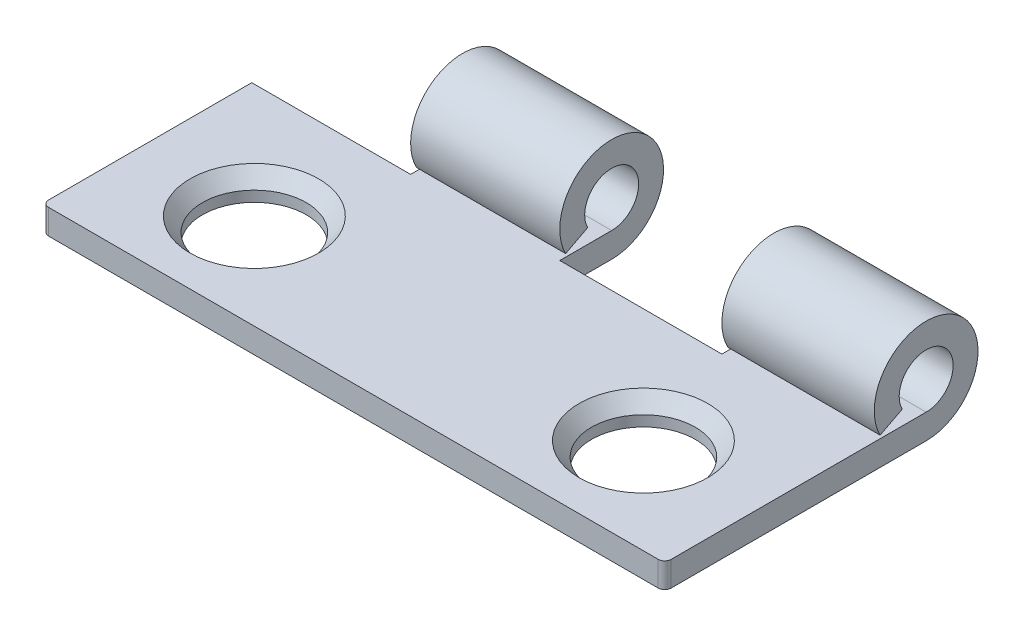
ISO-10303-21;
HEADER;
FILE_DESCRIPTION(('STEP AP214'),'2;1');
FILE_NAME('part.step','',(''),(''),'','','');
FILE_SCHEMA(('AUTOMOTIVE_DESIGN { 1 0 10303 214 1 1 1 1 }'));
ENDSEC;
DATA;
#1=APPLICATION_CONTEXT('core data for automotive mechanical design processes');
#2=APPLICATION_PROTOCOL_DEFINITION('international standard','automotive_design',2000,#1);
#3=PRODUCT_CONTEXT('',#1,'mechanical');
#4=PRODUCT('Part','Part','',(#3));
#5=PRODUCT_RELATED_PRODUCT_CATEGORY('part','',(#4));
#6=PRODUCT_DEFINITION_FORMATION('','',#4);
#7=PRODUCT_DEFINITION_CONTEXT('part definition',#1,'design');
#8=PRODUCT_DEFINITION('design','',#6,#7);
#9=PRODUCT_DEFINITION_SHAPE('','',#8);
#10=(LENGTH_UNIT() NAMED_UNIT(*) SI_UNIT(.MILLI.,.METRE.));
#11=(NAMED_UNIT(*) PLANE_ANGLE_UNIT() SI_UNIT($,.RADIAN.));
#12=(NAMED_UNIT(*) SI_UNIT($,.STERADIAN.) SOLID_ANGLE_UNIT());
#13=UNCERTAINTY_MEASURE_WITH_UNIT(LENGTH_MEASURE(1.E-05),#10,'distance_accuracy_value','');
#14=(GEOMETRIC_REPRESENTATION_CONTEXT(3) GLOBAL_UNCERTAINTY_ASSIGNED_CONTEXT((#13)) GLOBAL_UNIT_ASSIGNED_CONTEXT((#10,
#11,#12)) REPRESENTATION_CONTEXT('',''));
#15=CARTESIAN_POINT('',(0.,0.,0.));
#16=DIRECTION('',(0.,0.,1.));
#17=DIRECTION('',(1.,0.,0.));
#18=AXIS2_PLACEMENT_3D('',#15,#16,#17);
#19=CARTESIAN_POINT('',(19.05,0.,0.));
#20=DIRECTION('',(-1.,0.,0.));
#21=DIRECTION('',(0.,0.,1.));
#22=AXIS2_PLACEMENT_3D('',#19,#20,#21);
#23=CYLINDRICAL_SURFACE('',#22,3.17500000000008);
#24=CARTESIAN_POINT('',(-9.32656249999999,0.,0.));
#25=DIRECTION('',(1.,0.,0.));
#26=DIRECTION('',(0.,0.,-1.));
#27=AXIS2_PLACEMENT_3D('',#24,#25,#26);
#28=CIRCLE('',#27,3.17500000000008);
#29=CARTESIAN_POINT('',(-9.32656249999999,-3.175,0.));
#30=VERTEX_POINT('',#29);
#31=CARTESIAN_POINT('',(-9.32656249999999,-1.46479493883832,2.81691334391984));
#32=VERTEX_POINT('',#31);
#33=EDGE_CURVE('E180',#30,#32,#28,.T.);
#34=ORIENTED_EDGE('',*,*,#33,.T.);
#35=DIRECTION('',(-1.,0.,0.));
#36=VECTOR('',#35,1.);
#37=CARTESIAN_POINT('',(19.05,-1.46479493883832,2.81691334391984));
#38=LINE('',#37,#36);
#39=CARTESIAN_POINT('',(-0.198437500000002,-1.46479493883832,2.81691334391984));
#40=VERTEX_POINT('',#39);
#41=EDGE_CURVE('E247',#40,#32,#38,.T.);
#42=ORIENTED_EDGE('',*,*,#41,.F.);
#43=CARTESIAN_POINT('',(-0.198437500000002,0.,0.));
#44=DIRECTION('',(-1.,0.,0.));
#45=DIRECTION('',(0.,0.,1.));
#46=AXIS2_PLACEMENT_3D('',#43,#44,#45);
#47=CIRCLE('',#46,3.17500000000008);
#48=CARTESIAN_POINT('',(-0.198437500000001,-3.175,0.));
#49=VERTEX_POINT('',#48);
#50=EDGE_CURVE('E199',#40,#49,#47,.T.);
#51=ORIENTED_EDGE('',*,*,#50,.T.);
#52=DIRECTION('',(-1.,0.,0.));
#53=VECTOR('',#52,1.);
#54=CARTESIAN_POINT('',(19.05,-3.175,0.));
#55=LINE('',#54,#53);
#56=EDGE_CURVE('E251',#49,#30,#55,.T.);
#57=ORIENTED_EDGE('',*,*,#56,.T.);
#58=EDGE_LOOP('',(#34,#42,#51,#57));
#59=FACE_BOUND('',#58,.T.);
#60=ADVANCED_FACE('F41',(#59),#23,.T.);
#61=CARTESIAN_POINT('',(19.05,0.,0.));
#62=DIRECTION('',(-1.,0.,0.));
#63=DIRECTION('',(0.,0.,1.));
#64=AXIS2_PLACEMENT_3D('',#61,#62,#63);
#65=CYLINDRICAL_SURFACE('',#64,1.651);
#66=DIRECTION('',(-1.,0.,0.));
#67=VECTOR('',#66,1.);
#68=CARTESIAN_POINT('',(19.05,-0.761693368195924,1.46479493883832));
#69=LINE('',#68,#67);
#70=CARTESIAN_POINT('',(19.05,-0.761693368195924,1.46479493883832));
#71=VERTEX_POINT('',#70);
#72=CARTESIAN_POINT('',(9.7234375,-0.761693368195924,1.46479493883832));
#73=VERTEX_POINT('',#72);
#74=EDGE_CURVE('E244',#71,#73,#69,.T.);
#75=ORIENTED_EDGE('',*,*,#74,.T.);
#76=CARTESIAN_POINT('',(9.7234375,0.,0.));
#77=DIRECTION('',(1.,0.,0.));
#78=DIRECTION('',(0.,0.,-1.));
#79=AXIS2_PLACEMENT_3D('',#76,#77,#78);
#80=CIRCLE('',#79,1.651);
#81=CARTESIAN_POINT('',(9.7234375,-1.651,0.));
#82=VERTEX_POINT('',#81);
#83=EDGE_CURVE('E215',#73,#82,#80,.F.);
#84=ORIENTED_EDGE('',*,*,#83,.T.);
#85=DIRECTION('',(-1.,0.,0.));
#86=VECTOR('',#85,1.);
#87=CARTESIAN_POINT('',(19.05,-1.651,0.));
#88=LINE('',#87,#86);
#89=CARTESIAN_POINT('',(19.05,-1.651,0.));
#90=VERTEX_POINT('',#89);
#91=EDGE_CURVE('E261',#90,#82,#88,.T.);
#92=ORIENTED_EDGE('',*,*,#91,.F.);
#93=CARTESIAN_POINT('',(19.05,0.,0.));
#94=DIRECTION('',(-1.,0.,0.));
#95=DIRECTION('',(0.,0.,1.));
#96=AXIS2_PLACEMENT_3D('',#93,#94,#95);
#97=CIRCLE('',#96,1.651);
#98=EDGE_CURVE('E229',#71,#90,#97,.T.);
#99=ORIENTED_EDGE('',*,*,#98,.F.);
#100=EDGE_LOOP('',(#75,#84,#92,#99));
#101=FACE_BOUND('',#100,.T.);
#102=ADVANCED_FACE('F338',(#101),#65,.F.);
#103=CARTESIAN_POINT('',(9.7234375,0.,0.));
#104=DIRECTION('',(1.,0.,0.));
#105=DIRECTION('',(0.,0.,-1.));
#106=AXIS2_PLACEMENT_3D('',#103,#104,#105);
#107=CIRCLE('',#106,3.17500000000008);
#108=CARTESIAN_POINT('',(9.7234375,-3.175,0.));
#109=VERTEX_POINT('',#108);
#110=CARTESIAN_POINT('',(9.7234375,-1.46479493883832,2.81691334391984));
#111=VERTEX_POINT('',#110);
#112=EDGE_CURVE('E167',#109,#111,#107,.T.);
#113=ORIENTED_EDGE('',*,*,#112,.T.);
#114=CARTESIAN_POINT('',(19.05,-1.46479493883832,2.81691334391984));
#115=VERTEX_POINT('',#114);
#116=EDGE_CURVE('E248',#115,#111,#38,.T.);
#117=ORIENTED_EDGE('',*,*,#116,.F.);
#118=CARTESIAN_POINT('',(19.05,0.,0.));
#119=DIRECTION('',(1.,0.,0.));
#120=DIRECTION('',(0.,0.,1.));
#121=AXIS2_PLACEMENT_3D('',#118,#119,#120);
#122=CIRCLE('',#121,3.17500000000008);
#123=CARTESIAN_POINT('',(19.05,-3.175,0.));
#124=VERTEX_POINT('',#123);
#125=EDGE_CURVE('E237',#124,#115,#122,.T.);
#126=ORIENTED_EDGE('',*,*,#125,.F.);
#127=EDGE_CURVE('E252',#124,#109,#55,.T.);
#128=ORIENTED_EDGE('',*,*,#127,.T.);
#129=EDGE_LOOP('',(#113,#117,#126,#128));
#130=FACE_BOUND('',#129,.T.);
#131=ADVANCED_FACE('F331',(#130),#23,.T.);
#132=CARTESIAN_POINT('',(19.05,-0.761693368195924,1.46479493883832));
#133=DIRECTION('',(0.,0.887216801234595,0.46135273664199));
#134=DIRECTION('',(0.,-0.46135273664199,0.887216801234595));
#135=AXIS2_PLACEMENT_3D('',#132,#133,#134);
#136=PLANE('',#135);
#137=ORIENTED_EDGE('',*,*,#116,.T.);
#138=DIRECTION('',(0.,0.46135273664199,-0.887216801234595));
#139=VECTOR('',#138,1.);
#140=CARTESIAN_POINT('',(9.7234375,-0.761693368195924,1.46479493883832));
#141=LINE('',#140,#139);
#142=EDGE_CURVE('E218',#111,#73,#141,.T.);
#143=ORIENTED_EDGE('',*,*,#142,.T.);
#144=ORIENTED_EDGE('',*,*,#74,.F.);
#145=DIRECTION('',(0.,0.461352736641989,-0.887216801234595));
#146=VECTOR('',#145,1.);
#147=CARTESIAN_POINT('',(19.05,-0.761693368195924,1.46479493883832));
#148=LINE('',#147,#146);
#149=EDGE_CURVE('E239',#115,#71,#148,.T.);
#150=ORIENTED_EDGE('',*,*,#149,.F.);
#151=EDGE_LOOP('',(#137,#143,#144,#150));
#152=FACE_BOUND('',#151,.T.);
#153=ADVANCED_FACE('F336',(#152),#136,.F.);
#154=CARTESIAN_POINT('',(-0.198437500000002,-0.761693368195925,1.46479493883832));
#155=VERTEX_POINT('',#154);
#156=CARTESIAN_POINT('',(-9.32656249999999,-0.761693368195924,1.46479493883832));
#157=VERTEX_POINT('',#156);
#158=EDGE_CURVE('E241',#155,#157,#69,.T.);
#159=ORIENTED_EDGE('',*,*,#158,.T.);
#160=CARTESIAN_POINT('',(-9.32656249999999,0.,0.));
#161=DIRECTION('',(1.,0.,0.));
#162=DIRECTION('',(0.,0.,-1.));
#163=AXIS2_PLACEMENT_3D('',#160,#161,#162);
#164=CIRCLE('',#163,1.651);
#165=CARTESIAN_POINT('',(-9.32656249999999,-1.651,0.));
#166=VERTEX_POINT('',#165);
#167=EDGE_CURVE('E206',#157,#166,#164,.F.);
#168=ORIENTED_EDGE('',*,*,#167,.T.);
#169=CARTESIAN_POINT('',(-0.198437500000002,-1.651,0.));
#170=VERTEX_POINT('',#169);
#171=EDGE_CURVE('E260',#170,#166,#88,.T.);
#172=ORIENTED_EDGE('',*,*,#171,.F.);
#173=CARTESIAN_POINT('',(-0.198437500000002,0.,0.));
#174=DIRECTION('',(-1.,0.,0.));
#175=DIRECTION('',(0.,0.,1.));
#176=AXIS2_PLACEMENT_3D('',#173,#174,#175);
#177=CIRCLE('',#176,1.651);
#178=EDGE_CURVE('E176',#170,#155,#177,.F.);
#179=ORIENTED_EDGE('',*,*,#178,.T.);
#180=EDGE_LOOP('',(#159,#168,#172,#179));
#181=FACE_BOUND('',#180,.T.);
#182=ADVANCED_FACE('F310',(#181),#65,.F.);
#183=CARTESIAN_POINT('',(19.05,-1.651,16.002));
#184=DIRECTION('',(0.,-1.,0.));
#185=DIRECTION('',(0.,0.,-1.));
#186=AXIS2_PLACEMENT_3D('',#183,#184,#185);
#187=PLANE('',#186);
#188=CARTESIAN_POINT('',(-11.90625,-1.651,10.16));
#189=DIRECTION('',(0.,1.,0.));
#190=DIRECTION('',(0.,0.,1.));
#191=AXIS2_PLACEMENT_3D('',#188,#189,#190);
#192=CIRCLE('',#191,3.937);
#193=CARTESIAN_POINT('',(-11.90625,-1.651,14.097));
#194=VERTEX_POINT('',#193);
#195=EDGE_CURVE('E275',#194,#194,#192,.T.);
#196=ORIENTED_EDGE('',*,*,#195,.F.);
#197=EDGE_LOOP('',(#196));
#198=FACE_BOUND('',#197,.T.);
#199=CARTESIAN_POINT('',(11.90625,-1.651,10.16));
#200=DIRECTION('',(0.,1.,0.));
#201=DIRECTION('',(0.,0.,1.));
#202=AXIS2_PLACEMENT_3D('',#199,#200,#201);
#203=CIRCLE('',#202,3.937);
#204=CARTESIAN_POINT('',(11.90625,-1.651,14.097));
#205=VERTEX_POINT('',#204);
#206=EDGE_CURVE('E376',#205,#205,#203,.T.);
#207=ORIENTED_EDGE('',*,*,#206,.F.);
#208=EDGE_LOOP('',(#207));
#209=FACE_BOUND('',#208,.T.);
#210=DIRECTION('',(-1.,0.,0.));
#211=VECTOR('',#210,1.);
#212=CARTESIAN_POINT('',(19.05,-1.651,16.002));
#213=LINE('',#212,#211);
#214=CARTESIAN_POINT('',(18.653125,-1.651,16.002));
#215=VERTEX_POINT('',#214);
#216=CARTESIAN_POINT('',(-18.653125,-1.651,16.002));
#217=VERTEX_POINT('',#216);
#218=EDGE_CURVE('E258',#215,#217,#213,.T.);
#219=ORIENTED_EDGE('',*,*,#218,.F.);
#220=CARTESIAN_POINT('',(18.653125,-1.651,15.605125));
#221=DIRECTION('',(0.,-1.,0.));
#222=DIRECTION('',(0.,0.,-1.));
#223=AXIS2_PLACEMENT_3D('',#220,#221,#222);
#224=CIRCLE('',#223,0.396875);
#225=CARTESIAN_POINT('',(19.05,-1.651,15.605125));
#226=VERTEX_POINT('',#225);
#227=EDGE_CURVE('E49',#215,#226,#224,.F.);
#228=ORIENTED_EDGE('',*,*,#227,.T.);
#229=DIRECTION('',(0.,0.,1.));
#230=VECTOR('',#229,1.);
#231=CARTESIAN_POINT('',(19.05,-1.651,16.002));
#232=LINE('',#231,#230);
#233=EDGE_CURVE('E232',#90,#226,#232,.T.);
#234=ORIENTED_EDGE('',*,*,#233,.F.);
#235=ORIENTED_EDGE('',*,*,#91,.T.);
#236=DIRECTION('',(0.,0.,1.));
#237=VECTOR('',#236,1.);
#238=CARTESIAN_POINT('',(9.7234375,-1.651,16.002));
#239=LINE('',#238,#237);
#240=CARTESIAN_POINT('',(9.7234375,-1.651,3.17500000000003));
#241=VERTEX_POINT('',#240);
#242=EDGE_CURVE('E212',#82,#241,#239,.T.);
#243=ORIENTED_EDGE('',*,*,#242,.T.);
#244=DIRECTION('',(-1.,0.,0.));
#245=VECTOR('',#244,1.);
#246=CARTESIAN_POINT('',(19.05,-1.651,3.17500000000003));
#247=LINE('',#246,#245);
#248=CARTESIAN_POINT('',(-0.198437500000001,-1.651,3.17500000000003));
#249=VERTEX_POINT('',#248);
#250=EDGE_CURVE('E226',#241,#249,#247,.T.);
#251=ORIENTED_EDGE('',*,*,#250,.T.);
#252=DIRECTION('',(0.,0.,-1.));
#253=VECTOR('',#252,1.);
#254=CARTESIAN_POINT('',(-0.198437500000002,-1.651,16.002));
#255=LINE('',#254,#253);
#256=EDGE_CURVE('E201',#249,#170,#255,.T.);
#257=ORIENTED_EDGE('',*,*,#256,.T.);
#258=ORIENTED_EDGE('',*,*,#171,.T.);
#259=DIRECTION('',(0.,0.,1.));
#260=VECTOR('',#259,1.);
#261=CARTESIAN_POINT('',(-9.32656249999999,-1.651,16.002));
#262=LINE('',#261,#260);
#263=CARTESIAN_POINT('',(-9.32656249999999,-1.651,3.17500000000003));
#264=VERTEX_POINT('',#263);
#265=EDGE_CURVE('E208',#166,#264,#262,.T.);
#266=ORIENTED_EDGE('',*,*,#265,.T.);
#267=DIRECTION('',(-1.,0.,0.));
#268=VECTOR('',#267,1.);
#269=CARTESIAN_POINT('',(19.05,-1.651,3.17500000000003));
#270=LINE('',#269,#268);
#271=CARTESIAN_POINT('',(-19.05,-1.651,3.17500000000003));
#272=VERTEX_POINT('',#271);
#273=EDGE_CURVE('E173',#264,#272,#270,.T.);
#274=ORIENTED_EDGE('',*,*,#273,.T.);
#275=DIRECTION('',(0.,0.,1.));
#276=VECTOR('',#275,1.);
#277=CARTESIAN_POINT('',(-19.05,-1.651,16.002));
#278=LINE('',#277,#276);
#279=CARTESIAN_POINT('',(-19.05,-1.651,15.605125));
#280=VERTEX_POINT('',#279);
#281=EDGE_CURVE('E228',#272,#280,#278,.T.);
#282=ORIENTED_EDGE('',*,*,#281,.T.);
#283=CARTESIAN_POINT('',(-18.653125,-1.651,15.605125));
#284=DIRECTION('',(0.,-1.,0.));
#285=DIRECTION('',(0.,0.,-1.));
#286=AXIS2_PLACEMENT_3D('',#283,#284,#285);
#287=CIRCLE('',#286,0.396875);
#288=EDGE_CURVE('E61',#280,#217,#287,.F.);
#289=ORIENTED_EDGE('',*,*,#288,.T.);
#290=EDGE_LOOP('',(#219,#228,#234,#235,#243,#251,#257,#258,#266,#274,#282,#289));
#291=FACE_BOUND('',#290,.T.);
#292=ADVANCED_FACE('F290',(#198,#209,#291),#187,.F.);
#293=CARTESIAN_POINT('',(19.05,-3.175,16.002));
#294=DIRECTION('',(0.,0.,-1.));
#295=DIRECTION('',(-1.,0.,0.));
#296=AXIS2_PLACEMENT_3D('',#293,#294,#295);
#297=PLANE('',#296);
#298=DIRECTION('',(-1.,0.,0.));
#299=VECTOR('',#298,1.);
#300=CARTESIAN_POINT('',(19.05,-3.175,16.002));
#301=LINE('',#300,#299);
#302=CARTESIAN_POINT('',(18.653125,-3.175,16.002));
#303=VERTEX_POINT('',#302);
#304=CARTESIAN_POINT('',(-18.653125,-3.175,16.002));
#305=VERTEX_POINT('',#304);
#306=EDGE_CURVE('E255',#303,#305,#301,.T.);
#307=ORIENTED_EDGE('',*,*,#306,.F.);
#308=DIRECTION('',(0.,-1.,0.));
#309=VECTOR('',#308,1.);
#310=CARTESIAN_POINT('',(18.653125,-3.175,16.002));
#311=LINE('',#310,#309);
#312=EDGE_CURVE('E287',#303,#215,#311,.F.);
#313=ORIENTED_EDGE('',*,*,#312,.T.);
#314=ORIENTED_EDGE('',*,*,#218,.T.);
#315=DIRECTION('',(0.,-1.,0.));
#316=VECTOR('',#315,1.);
#317=CARTESIAN_POINT('',(-18.653125,-3.175,16.002));
#318=LINE('',#317,#316);
#319=EDGE_CURVE('E284',#217,#305,#318,.T.);
#320=ORIENTED_EDGE('',*,*,#319,.T.);
#321=EDGE_LOOP('',(#307,#313,#314,#320));
#322=FACE_BOUND('',#321,.T.);
#323=ADVANCED_FACE('F302',(#322),#297,.F.);
#324=CARTESIAN_POINT('',(19.05,-3.175,0.));
#325=DIRECTION('',(0.,1.,0.));
#326=DIRECTION('',(0.,0.,1.));
#327=AXIS2_PLACEMENT_3D('',#324,#325,#326);
#328=PLANE('',#327);
#329=CARTESIAN_POINT('',(11.90625,-3.175,10.16));
#330=DIRECTION('',(0.,1.,0.));
#331=DIRECTION('',(0.,0.,1.));
#332=AXIS2_PLACEMENT_3D('',#329,#330,#331);
#333=CIRCLE('',#332,3.175);
#334=CARTESIAN_POINT('',(11.90625,-3.175,13.335));
#335=VERTEX_POINT('',#334);
#336=EDGE_CURVE('E196',#335,#335,#333,.T.);
#337=ORIENTED_EDGE('',*,*,#336,.T.);
#338=EDGE_LOOP('',(#337));
#339=FACE_BOUND('',#338,.T.);
#340=CARTESIAN_POINT('',(-11.90625,-3.175,10.16));
#341=DIRECTION('',(0.,1.,0.));
#342=DIRECTION('',(0.,0.,1.));
#343=AXIS2_PLACEMENT_3D('',#340,#341,#342);
#344=CIRCLE('',#343,3.175);
#345=CARTESIAN_POINT('',(-11.90625,-3.175,13.335));
#346=VERTEX_POINT('',#345);
#347=EDGE_CURVE('E187',#346,#346,#344,.T.);
#348=ORIENTED_EDGE('',*,*,#347,.T.);
#349=EDGE_LOOP('',(#348));
#350=FACE_BOUND('',#349,.T.);
#351=DIRECTION('',(0.,0.,-1.));
#352=VECTOR('',#351,1.);
#353=CARTESIAN_POINT('',(19.05,-3.175,0.));
#354=LINE('',#353,#352);
#355=CARTESIAN_POINT('',(19.05,-3.175,15.605125));
#356=VERTEX_POINT('',#355);
#357=EDGE_CURVE('E235',#356,#124,#354,.T.);
#358=ORIENTED_EDGE('',*,*,#357,.F.);
#359=CARTESIAN_POINT('',(18.653125,-3.175,15.605125));
#360=DIRECTION('',(0.,1.,0.));
#361=DIRECTION('',(0.,0.,1.));
#362=AXIS2_PLACEMENT_3D('',#359,#360,#361);
#363=CIRCLE('',#362,0.396875);
#364=EDGE_CURVE('E282',#356,#303,#363,.F.);
#365=ORIENTED_EDGE('',*,*,#364,.T.);
#366=ORIENTED_EDGE('',*,*,#306,.T.);
#367=CARTESIAN_POINT('',(-18.653125,-3.175,15.605125));
#368=DIRECTION('',(0.,1.,0.));
#369=DIRECTION('',(0.,0.,1.));
#370=AXIS2_PLACEMENT_3D('',#367,#368,#369);
#371=CIRCLE('',#370,0.396875);
#372=CARTESIAN_POINT('',(-19.05,-3.175,15.605125));
#373=VERTEX_POINT('',#372);
#374=EDGE_CURVE('E280',#305,#373,#371,.F.);
#375=ORIENTED_EDGE('',*,*,#374,.T.);
#376=DIRECTION('',(0.,0.,-1.));
#377=VECTOR('',#376,1.);
#378=CARTESIAN_POINT('',(-19.05,-3.175,0.));
#379=LINE('',#378,#377);
#380=CARTESIAN_POINT('',(-19.05,-3.175,3.17500000000003));
#381=VERTEX_POINT('',#380);
#382=EDGE_CURVE('E163',#373,#381,#379,.T.);
#383=ORIENTED_EDGE('',*,*,#382,.T.);
#384=DIRECTION('',(1.,0.,0.));
#385=VECTOR('',#384,1.);
#386=CARTESIAN_POINT('',(-9.525,-3.175,3.17500000000003));
#387=LINE('',#386,#385);
#388=CARTESIAN_POINT('',(-9.32656249999999,-3.175,3.17500000000003));
#389=VERTEX_POINT('',#388);
#390=EDGE_CURVE('E155',#381,#389,#387,.T.);
#391=ORIENTED_EDGE('',*,*,#390,.T.);
#392=DIRECTION('',(0.,0.,-1.));
#393=VECTOR('',#392,1.);
#394=CARTESIAN_POINT('',(-9.32656249999999,-3.175,-3.17500000000013));
#395=LINE('',#394,#393);
#396=EDGE_CURVE('E161',#389,#30,#395,.T.);
#397=ORIENTED_EDGE('',*,*,#396,.T.);
#398=ORIENTED_EDGE('',*,*,#56,.F.);
#399=DIRECTION('',(0.,0.,1.));
#400=VECTOR('',#399,1.);
#401=CARTESIAN_POINT('',(-0.198437500000001,-3.175,-3.17500000000013));
#402=LINE('',#401,#400);
#403=CARTESIAN_POINT('',(-0.198437500000001,-3.175,3.17500000000003));
#404=VERTEX_POINT('',#403);
#405=EDGE_CURVE('E184',#49,#404,#402,.T.);
#406=ORIENTED_EDGE('',*,*,#405,.T.);
#407=DIRECTION('',(1.,0.,0.));
#408=VECTOR('',#407,1.);
#409=CARTESIAN_POINT('',(9.525,-3.175,3.17500000000003));
#410=LINE('',#409,#408);
#411=CARTESIAN_POINT('',(9.7234375,-3.175,3.17500000000003));
#412=VERTEX_POINT('',#411);
#413=EDGE_CURVE('E224',#404,#412,#410,.T.);
#414=ORIENTED_EDGE('',*,*,#413,.T.);
#415=DIRECTION('',(0.,0.,-1.));
#416=VECTOR('',#415,1.);
#417=CARTESIAN_POINT('',(9.7234375,-3.175,-3.17500000000013));
#418=LINE('',#417,#416);
#419=EDGE_CURVE('E193',#412,#109,#418,.T.);
#420=ORIENTED_EDGE('',*,*,#419,.T.);
#421=ORIENTED_EDGE('',*,*,#127,.F.);
#422=EDGE_LOOP('',(#358,#365,#366,#375,#383,#391,#397,#398,#406,#414,#420,#421));
#423=FACE_BOUND('',#422,.T.);
#424=ADVANCED_FACE('F158',(#339,#350,#423),#328,.F.);
#425=ORIENTED_EDGE('',*,*,#41,.T.);
#426=DIRECTION('',(0.,0.46135273664199,-0.887216801234595));
#427=VECTOR('',#426,1.);
#428=CARTESIAN_POINT('',(-9.32656249999999,-0.761693368195924,1.46479493883832));
#429=LINE('',#428,#427);
#430=EDGE_CURVE('E267',#32,#157,#429,.T.);
#431=ORIENTED_EDGE('',*,*,#430,.T.);
#432=ORIENTED_EDGE('',*,*,#158,.F.);
#433=DIRECTION('',(0.,-0.46135273664199,0.887216801234595));
#434=VECTOR('',#433,1.);
#435=CARTESIAN_POINT('',(-0.198437500000002,-0.761693368195925,1.46479493883832));
#436=LINE('',#435,#434);
#437=EDGE_CURVE('E264',#155,#40,#436,.T.);
#438=ORIENTED_EDGE('',*,*,#437,.T.);
#439=EDGE_LOOP('',(#425,#431,#432,#438));
#440=FACE_BOUND('',#439,.T.);
#441=ADVANCED_FACE('F314',(#440),#136,.F.);
#442=CARTESIAN_POINT('',(19.05,0.,0.));
#443=DIRECTION('',(-1.,0.,0.));
#444=DIRECTION('',(0.,0.,1.));
#445=AXIS2_PLACEMENT_3D('',#442,#443,#444);
#446=PLANE('',#445);
#447=ORIENTED_EDGE('',*,*,#233,.T.);
#448=DIRECTION('',(0.,-1.,0.));
#449=VECTOR('',#448,1.);
#450=CARTESIAN_POINT('',(19.05,0.,15.605125));
#451=LINE('',#450,#449);
#452=EDGE_CURVE('E270',#226,#356,#451,.T.);
#453=ORIENTED_EDGE('',*,*,#452,.T.);
#454=ORIENTED_EDGE('',*,*,#357,.T.);
#455=ORIENTED_EDGE('',*,*,#125,.T.);
#456=ORIENTED_EDGE('',*,*,#149,.T.);
#457=ORIENTED_EDGE('',*,*,#98,.T.);
#458=EDGE_LOOP('',(#447,#453,#454,#455,#456,#457));
#459=FACE_BOUND('',#458,.T.);
#460=ADVANCED_FACE('F295',(#459),#446,.F.);
#461=CARTESIAN_POINT('',(-19.05,0.,0.));
#462=DIRECTION('',(-1.,0.,0.));
#463=DIRECTION('',(0.,0.,1.));
#464=AXIS2_PLACEMENT_3D('',#461,#462,#463);
#465=PLANE('',#464);
#466=ORIENTED_EDGE('',*,*,#382,.F.);
#467=DIRECTION('',(0.,-1.,0.));
#468=VECTOR('',#467,1.);
#469=CARTESIAN_POINT('',(-19.05,-1.651,15.605125));
#470=LINE('',#469,#468);
#471=EDGE_CURVE('E11',#373,#280,#470,.F.);
#472=ORIENTED_EDGE('',*,*,#471,.T.);
#473=ORIENTED_EDGE('',*,*,#281,.F.);
#474=DIRECTION('',(0.,1.,0.));
#475=VECTOR('',#474,1.);
#476=CARTESIAN_POINT('',(-19.05,-3.175,3.17500000000003));
#477=LINE('',#476,#475);
#478=EDGE_CURVE('E166',#381,#272,#477,.T.);
#479=ORIENTED_EDGE('',*,*,#478,.F.);
#480=EDGE_LOOP('',(#466,#472,#473,#479));
#481=FACE_BOUND('',#480,.T.);
#482=ADVANCED_FACE('F305',(#481),#465,.T.);
#483=CARTESIAN_POINT('',(9.525,-3.175,3.17500000000003));
#484=DIRECTION('',(0.,0.,1.));
#485=DIRECTION('',(1.,0.,0.));
#486=AXIS2_PLACEMENT_3D('',#483,#484,#485);
#487=PLANE('',#486);
#488=ORIENTED_EDGE('',*,*,#250,.F.);
#489=DIRECTION('',(0.,1.,0.));
#490=VECTOR('',#489,1.);
#491=CARTESIAN_POINT('',(9.7234375,-3.175,3.17500000000003));
#492=LINE('',#491,#490);
#493=EDGE_CURVE('E191',#412,#241,#492,.T.);
#494=ORIENTED_EDGE('',*,*,#493,.F.);
#495=ORIENTED_EDGE('',*,*,#413,.F.);
#496=DIRECTION('',(0.,1.,0.));
#497=VECTOR('',#496,1.);
#498=CARTESIAN_POINT('',(-0.198437500000001,-3.175,3.17500000000003));
#499=LINE('',#498,#497);
#500=EDGE_CURVE('E181',#404,#249,#499,.T.);
#501=ORIENTED_EDGE('',*,*,#500,.T.);
#502=EDGE_LOOP('',(#488,#494,#495,#501));
#503=FACE_BOUND('',#502,.T.);
#504=ADVANCED_FACE('F324',(#503),#487,.F.);
#505=CARTESIAN_POINT('',(-9.525,-3.175,3.17500000000003));
#506=DIRECTION('',(0.,0.,1.));
#507=DIRECTION('',(1.,0.,0.));
#508=AXIS2_PLACEMENT_3D('',#505,#506,#507);
#509=PLANE('',#508);
#510=ORIENTED_EDGE('',*,*,#273,.F.);
#511=DIRECTION('',(0.,1.,0.));
#512=VECTOR('',#511,1.);
#513=CARTESIAN_POINT('',(-9.32656249999999,-3.175,3.17500000000003));
#514=LINE('',#513,#512);
#515=EDGE_CURVE('E170',#389,#264,#514,.T.);
#516=ORIENTED_EDGE('',*,*,#515,.F.);
#517=ORIENTED_EDGE('',*,*,#390,.F.);
#518=ORIENTED_EDGE('',*,*,#478,.T.);
#519=EDGE_LOOP('',(#510,#516,#517,#518));
#520=FACE_BOUND('',#519,.T.);
#521=ADVANCED_FACE('F171',(#520),#509,.F.);
#522=CARTESIAN_POINT('',(-9.32656249999999,-3.175,-3.17500000000013));
#523=DIRECTION('',(1.,0.,0.));
#524=DIRECTION('',(0.,0.,-1.));
#525=AXIS2_PLACEMENT_3D('',#522,#523,#524);
#526=PLANE('',#525);
#527=ORIENTED_EDGE('',*,*,#167,.F.);
#528=ORIENTED_EDGE('',*,*,#430,.F.);
#529=ORIENTED_EDGE('',*,*,#33,.F.);
#530=ORIENTED_EDGE('',*,*,#396,.F.);
#531=ORIENTED_EDGE('',*,*,#515,.T.);
#532=ORIENTED_EDGE('',*,*,#265,.F.);
#533=EDGE_LOOP('',(#527,#528,#529,#530,#531,#532));
#534=FACE_BOUND('',#533,.T.);
#535=ADVANCED_FACE('F178',(#534),#526,.F.);
#536=CARTESIAN_POINT('',(-0.198437500000001,-3.175,-3.17500000000013));
#537=DIRECTION('',(-1.,0.,0.));
#538=DIRECTION('',(0.,0.,1.));
#539=AXIS2_PLACEMENT_3D('',#536,#537,#538);
#540=PLANE('',#539);
#541=ORIENTED_EDGE('',*,*,#50,.F.);
#542=ORIENTED_EDGE('',*,*,#437,.F.);
#543=ORIENTED_EDGE('',*,*,#178,.F.);
#544=ORIENTED_EDGE('',*,*,#256,.F.);
#545=ORIENTED_EDGE('',*,*,#500,.F.);
#546=ORIENTED_EDGE('',*,*,#405,.F.);
#547=EDGE_LOOP('',(#541,#542,#543,#544,#545,#546));
#548=FACE_BOUND('',#547,.T.);
#549=ADVANCED_FACE('F321',(#548),#540,.F.);
#550=CARTESIAN_POINT('',(9.7234375,-3.175,-3.17500000000013));
#551=DIRECTION('',(1.,0.,0.));
#552=DIRECTION('',(0.,0.,-1.));
#553=AXIS2_PLACEMENT_3D('',#550,#551,#552);
#554=PLANE('',#553);
#555=ORIENTED_EDGE('',*,*,#419,.F.);
#556=ORIENTED_EDGE('',*,*,#493,.T.);
#557=ORIENTED_EDGE('',*,*,#242,.F.);
#558=ORIENTED_EDGE('',*,*,#83,.F.);
#559=ORIENTED_EDGE('',*,*,#142,.F.);
#560=ORIENTED_EDGE('',*,*,#112,.F.);
#561=EDGE_LOOP('',(#555,#556,#557,#558,#559,#560));
#562=FACE_BOUND('',#561,.T.);
#563=ADVANCED_FACE('F327',(#562),#554,.F.);
#564=CARTESIAN_POINT('',(-11.90625,-3.175,10.16));
#565=DIRECTION('',(0.,1.,0.));
#566=DIRECTION('',(0.,0.,1.));
#567=AXIS2_PLACEMENT_3D('',#564,#565,#566);
#568=CYLINDRICAL_SURFACE('',#567,3.175);
#569=CARTESIAN_POINT('',(-11.90625,-2.52758072630241,10.16));
#570=DIRECTION('',(0.,1.,0.));
#571=DIRECTION('',(0.,0.,1.));
#572=AXIS2_PLACEMENT_3D('',#569,#570,#571);
#573=CIRCLE('',#572,3.175);
#574=CARTESIAN_POINT('',(-11.90625,-2.52758072630241,13.335));
#575=VERTEX_POINT('',#574);
#576=EDGE_CURVE('E274',#575,#575,#573,.T.);
#577=ORIENTED_EDGE('',*,*,#576,.T.);
#578=EDGE_LOOP('',(#577));
#579=FACE_BOUND('',#578,.T.);
#580=ORIENTED_EDGE('',*,*,#347,.F.);
#581=EDGE_LOOP('',(#580));
#582=FACE_BOUND('',#581,.T.);
#583=ADVANCED_FACE('F396',(#579,#582),#568,.F.);
#584=CARTESIAN_POINT('',(11.90625,-3.175,10.16));
#585=DIRECTION('',(0.,1.,0.));
#586=DIRECTION('',(0.,0.,1.));
#587=AXIS2_PLACEMENT_3D('',#584,#585,#586);
#588=CYLINDRICAL_SURFACE('',#587,3.175);
#589=CARTESIAN_POINT('',(11.90625,-2.52758072630241,10.16));
#590=DIRECTION('',(0.,1.,0.));
#591=DIRECTION('',(0.,0.,1.));
#592=AXIS2_PLACEMENT_3D('',#589,#590,#591);
#593=CIRCLE('',#592,3.175);
#594=CARTESIAN_POINT('',(11.90625,-2.52758072630241,13.335));
#595=VERTEX_POINT('',#594);
#596=EDGE_CURVE('E271',#595,#595,#593,.T.);
#597=ORIENTED_EDGE('',*,*,#596,.T.);
#598=EDGE_LOOP('',(#597));
#599=FACE_BOUND('',#598,.T.);
#600=ORIENTED_EDGE('',*,*,#336,.F.);
#601=EDGE_LOOP('',(#600));
#602=FACE_BOUND('',#601,.T.);
#603=ADVANCED_FACE('F390',(#599,#602),#588,.F.);
#604=CARTESIAN_POINT('',(11.90625,-1.651,10.16));
#605=DIRECTION('',(0.,1.,0.));
#606=DIRECTION('',(0.,0.,1.));
#607=AXIS2_PLACEMENT_3D('',#604,#605,#606);
#608=CONICAL_SURFACE('',#607,3.937,0.715584993317677);
#609=ORIENTED_EDGE('',*,*,#206,.T.);
#610=EDGE_LOOP('',(#609));
#611=FACE_BOUND('',#610,.T.);
#612=ORIENTED_EDGE('',*,*,#596,.F.);
#613=EDGE_LOOP('',(#612));
#614=FACE_BOUND('',#613,.T.);
#615=ADVANCED_FACE('F387',(#611,#614),#608,.F.);
#616=CARTESIAN_POINT('',(-11.90625,-1.651,10.16));
#617=DIRECTION('',(0.,1.,0.));
#618=DIRECTION('',(0.,0.,1.));
#619=AXIS2_PLACEMENT_3D('',#616,#617,#618);
#620=CONICAL_SURFACE('',#619,3.937,0.715584993317677);
#621=ORIENTED_EDGE('',*,*,#195,.T.);
#622=EDGE_LOOP('',(#621));
#623=FACE_BOUND('',#622,.T.);
#624=ORIENTED_EDGE('',*,*,#576,.F.);
#625=EDGE_LOOP('',(#624));
#626=FACE_BOUND('',#625,.T.);
#627=ADVANCED_FACE('F382',(#623,#626),#620,.F.);
#628=CARTESIAN_POINT('',(18.653125,0.,15.605125));
#629=DIRECTION('',(0.,-1.,0.));
#630=DIRECTION('',(0.,0.,-1.));
#631=AXIS2_PLACEMENT_3D('',#628,#629,#630);
#632=CYLINDRICAL_SURFACE('',#631,0.396875);
#633=ORIENTED_EDGE('',*,*,#227,.F.);
#634=ORIENTED_EDGE('',*,*,#312,.F.);
#635=ORIENTED_EDGE('',*,*,#364,.F.);
#636=ORIENTED_EDGE('',*,*,#452,.F.);
#637=EDGE_LOOP('',(#633,#634,#635,#636));
#638=FACE_BOUND('',#637,.T.);
#639=ADVANCED_FACE('F298',(#638),#632,.T.);
#640=CARTESIAN_POINT('',(-18.653125,-3.175,15.605125));
#641=DIRECTION('',(0.,1.,0.));
#642=DIRECTION('',(0.,0.,1.));
#643=AXIS2_PLACEMENT_3D('',#640,#641,#642);
#644=CYLINDRICAL_SURFACE('',#643,0.396875);
#645=ORIENTED_EDGE('',*,*,#288,.F.);
#646=ORIENTED_EDGE('',*,*,#471,.F.);
#647=ORIENTED_EDGE('',*,*,#374,.F.);
#648=ORIENTED_EDGE('',*,*,#319,.F.);
#649=EDGE_LOOP('',(#645,#646,#647,#648));
#650=FACE_BOUND('',#649,.T.);
#651=ADVANCED_FACE('F43',(#650),#644,.T.);
#652=CLOSED_SHELL('',(#60,#102,#131,#153,#182,#292,#323,#424,#441,#460,#482,#504,#521,#535,#549,
#563,#583,#603,#615,#627,#639,#651));
#653=MANIFOLD_SOLID_BREP('B2',#652);
#654=ADVANCED_BREP_SHAPE_REPRESENTATION('',(#18,#653),#14);
#655=SHAPE_DEFINITION_REPRESENTATION(#9,#654);
ENDSEC;
END-ISO-10303-21;
